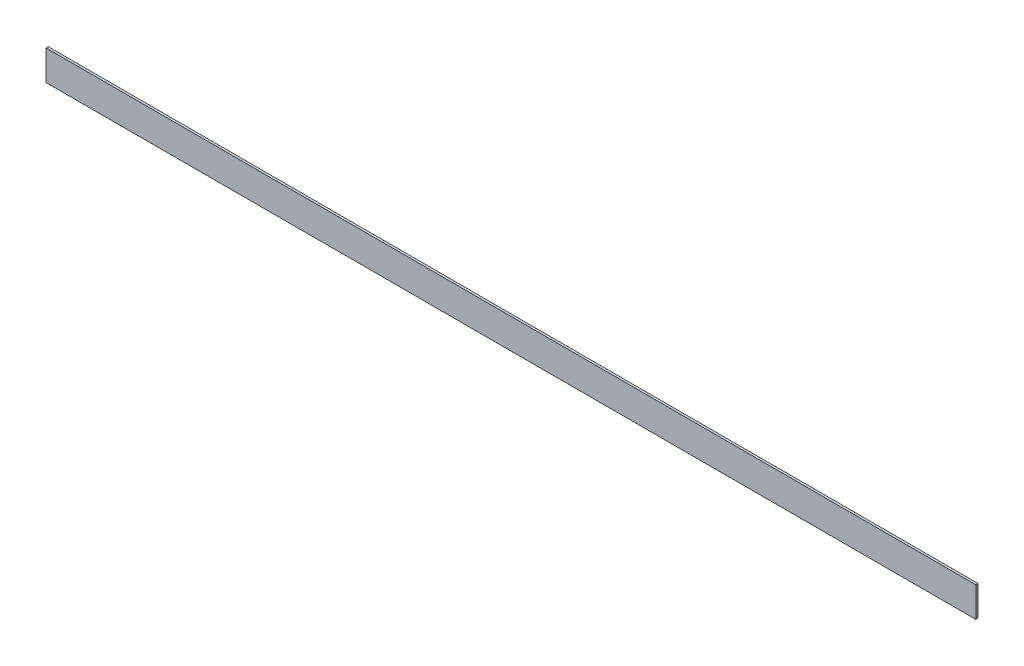
ISO-10303-21;
HEADER;
FILE_DESCRIPTION(('STEP AP214'),'2;1');
FILE_NAME('part.step','',(''),(''),'','','');
FILE_SCHEMA(('AUTOMOTIVE_DESIGN { 1 0 10303 214 1 1 1 1 }'));
ENDSEC;
DATA;
#1=APPLICATION_CONTEXT('core data for automotive mechanical design processes');
#2=APPLICATION_PROTOCOL_DEFINITION('international standard','automotive_design',2000,#1);
#3=PRODUCT_CONTEXT('',#1,'mechanical');
#4=PRODUCT('Part','Part','',(#3));
#5=PRODUCT_RELATED_PRODUCT_CATEGORY('part','',(#4));
#6=PRODUCT_DEFINITION_FORMATION('','',#4);
#7=PRODUCT_DEFINITION_CONTEXT('part definition',#1,'design');
#8=PRODUCT_DEFINITION('design','',#6,#7);
#9=PRODUCT_DEFINITION_SHAPE('','',#8);
#10=(LENGTH_UNIT() NAMED_UNIT(*) SI_UNIT(.MILLI.,.METRE.));
#11=(NAMED_UNIT(*) PLANE_ANGLE_UNIT() SI_UNIT($,.RADIAN.));
#12=(NAMED_UNIT(*) SI_UNIT($,.STERADIAN.) SOLID_ANGLE_UNIT());
#13=UNCERTAINTY_MEASURE_WITH_UNIT(LENGTH_MEASURE(1.E-05),#10,'distance_accuracy_value','');
#14=(GEOMETRIC_REPRESENTATION_CONTEXT(3) GLOBAL_UNCERTAINTY_ASSIGNED_CONTEXT((#13)) GLOBAL_UNIT_ASSIGNED_CONTEXT((#10,
#11,#12)) REPRESENTATION_CONTEXT('',''));
#15=CARTESIAN_POINT('',(0.,0.,0.));
#16=DIRECTION('',(0.,0.,1.));
#17=DIRECTION('',(1.,0.,0.));
#18=AXIS2_PLACEMENT_3D('',#15,#16,#17);
#19=CARTESIAN_POINT('',(40.,1052.,-800.));
#20=DIRECTION('',(-1.,0.,0.));
#21=DIRECTION('',(0.,0.,1.));
#22=AXIS2_PLACEMENT_3D('',#19,#20,#21);
#23=PLANE('',#22);
#24=DIRECTION('',(0.,-1.,0.));
#25=VECTOR('',#24,1.);
#26=CARTESIAN_POINT('',(40.,1052.,-798.5));
#27=LINE('',#26,#25);
#28=CARTESIAN_POINT('',(40.,1072.,-798.5));
#29=VERTEX_POINT('',#28);
#30=CARTESIAN_POINT('',(40.,1052.,-798.5));
#31=VERTEX_POINT('',#30);
#32=EDGE_CURVE('E103',#29,#31,#27,.T.);
#33=ORIENTED_EDGE('',*,*,#32,.F.);
#34=DIRECTION('',(0.,0.,1.));
#35=VECTOR('',#34,1.);
#36=CARTESIAN_POINT('',(40.,1072.,-800.));
#37=LINE('',#36,#35);
#38=CARTESIAN_POINT('',(40.,1072.,-800.));
#39=VERTEX_POINT('',#38);
#40=EDGE_CURVE('E11',#39,#29,#37,.T.);
#41=ORIENTED_EDGE('',*,*,#40,.F.);
#42=DIRECTION('',(0.,-1.,0.));
#43=VECTOR('',#42,1.);
#44=CARTESIAN_POINT('',(40.,1052.,-800.));
#45=LINE('',#44,#43);
#46=CARTESIAN_POINT('',(40.,1052.,-800.));
#47=VERTEX_POINT('',#46);
#48=EDGE_CURVE('E97',#39,#47,#45,.T.);
#49=ORIENTED_EDGE('',*,*,#48,.T.);
#50=DIRECTION('',(0.,0.,1.));
#51=VECTOR('',#50,1.);
#52=CARTESIAN_POINT('',(40.,1052.,-800.));
#53=LINE('',#52,#51);
#54=EDGE_CURVE('E42',#47,#31,#53,.T.);
#55=ORIENTED_EDGE('',*,*,#54,.T.);
#56=EDGE_LOOP('',(#33,#41,#49,#55));
#57=FACE_BOUND('',#56,.T.);
#58=ADVANCED_FACE('F39',(#57),#23,.T.);
#59=CARTESIAN_POINT('',(40.,1072.,-800.));
#60=DIRECTION('',(0.,1.,0.));
#61=DIRECTION('',(0.,0.,1.));
#62=AXIS2_PLACEMENT_3D('',#59,#60,#61);
#63=PLANE('',#62);
#64=DIRECTION('',(-1.,0.,0.));
#65=VECTOR('',#64,1.);
#66=CARTESIAN_POINT('',(40.,1072.,-798.5));
#67=LINE('',#66,#65);
#68=CARTESIAN_POINT('',(660.,1072.,-798.5));
#69=VERTEX_POINT('',#68);
#70=EDGE_CURVE('E99',#69,#29,#67,.T.);
#71=ORIENTED_EDGE('',*,*,#70,.F.);
#72=DIRECTION('',(0.,0.,1.));
#73=VECTOR('',#72,1.);
#74=CARTESIAN_POINT('',(660.,1072.,-800.));
#75=LINE('',#74,#73);
#76=CARTESIAN_POINT('',(660.,1072.,-800.));
#77=VERTEX_POINT('',#76);
#78=EDGE_CURVE('E48',#77,#69,#75,.T.);
#79=ORIENTED_EDGE('',*,*,#78,.F.);
#80=DIRECTION('',(-1.,0.,0.));
#81=VECTOR('',#80,1.);
#82=CARTESIAN_POINT('',(40.,1072.,-800.));
#83=LINE('',#82,#81);
#84=EDGE_CURVE('E94',#77,#39,#83,.T.);
#85=ORIENTED_EDGE('',*,*,#84,.T.);
#86=ORIENTED_EDGE('',*,*,#40,.T.);
#87=EDGE_LOOP('',(#71,#79,#85,#86));
#88=FACE_BOUND('',#87,.T.);
#89=ADVANCED_FACE('F113',(#88),#63,.T.);
#90=CARTESIAN_POINT('',(660.,1052.,-800.));
#91=DIRECTION('',(1.,0.,0.));
#92=DIRECTION('',(0.,0.,-1.));
#93=AXIS2_PLACEMENT_3D('',#90,#91,#92);
#94=PLANE('',#93);
#95=DIRECTION('',(0.,1.,0.));
#96=VECTOR('',#95,1.);
#97=CARTESIAN_POINT('',(660.,1052.,-798.5));
#98=LINE('',#97,#96);
#99=CARTESIAN_POINT('',(660.,1052.,-798.5));
#100=VERTEX_POINT('',#99);
#101=EDGE_CURVE('E89',#100,#69,#98,.T.);
#102=ORIENTED_EDGE('',*,*,#101,.F.);
#103=DIRECTION('',(0.,0.,1.));
#104=VECTOR('',#103,1.);
#105=CARTESIAN_POINT('',(660.,1052.,-800.));
#106=LINE('',#105,#104);
#107=CARTESIAN_POINT('',(660.,1052.,-800.));
#108=VERTEX_POINT('',#107);
#109=EDGE_CURVE('E84',#108,#100,#106,.T.);
#110=ORIENTED_EDGE('',*,*,#109,.F.);
#111=DIRECTION('',(0.,1.,0.));
#112=VECTOR('',#111,1.);
#113=CARTESIAN_POINT('',(660.,1052.,-800.));
#114=LINE('',#113,#112);
#115=EDGE_CURVE('E87',#108,#77,#114,.T.);
#116=ORIENTED_EDGE('',*,*,#115,.T.);
#117=ORIENTED_EDGE('',*,*,#78,.T.);
#118=EDGE_LOOP('',(#102,#110,#116,#117));
#119=FACE_BOUND('',#118,.T.);
#120=ADVANCED_FACE('F86',(#119),#94,.T.);
#121=CARTESIAN_POINT('',(40.,1052.,-800.));
#122=DIRECTION('',(0.,-1.,0.));
#123=DIRECTION('',(0.,0.,-1.));
#124=AXIS2_PLACEMENT_3D('',#121,#122,#123);
#125=PLANE('',#124);
#126=DIRECTION('',(1.,0.,0.));
#127=VECTOR('',#126,1.);
#128=CARTESIAN_POINT('',(40.,1052.,-798.5));
#129=LINE('',#128,#127);
#130=EDGE_CURVE('E106',#31,#100,#129,.T.);
#131=ORIENTED_EDGE('',*,*,#130,.F.);
#132=ORIENTED_EDGE('',*,*,#54,.F.);
#133=DIRECTION('',(1.,0.,0.));
#134=VECTOR('',#133,1.);
#135=CARTESIAN_POINT('',(40.,1052.,-800.));
#136=LINE('',#135,#134);
#137=EDGE_CURVE('E93',#47,#108,#136,.T.);
#138=ORIENTED_EDGE('',*,*,#137,.T.);
#139=ORIENTED_EDGE('',*,*,#109,.T.);
#140=EDGE_LOOP('',(#131,#132,#138,#139));
#141=FACE_BOUND('',#140,.T.);
#142=ADVANCED_FACE('F96',(#141),#125,.T.);
#143=CARTESIAN_POINT('',(0.,0.,-800.));
#144=DIRECTION('',(0.,0.,-1.));
#145=DIRECTION('',(-1.,0.,0.));
#146=AXIS2_PLACEMENT_3D('',#143,#144,#145);
#147=PLANE('',#146);
#148=ORIENTED_EDGE('',*,*,#48,.F.);
#149=ORIENTED_EDGE('',*,*,#84,.F.);
#150=ORIENTED_EDGE('',*,*,#115,.F.);
#151=ORIENTED_EDGE('',*,*,#137,.F.);
#152=EDGE_LOOP('',(#148,#149,#150,#151));
#153=FACE_BOUND('',#152,.T.);
#154=ADVANCED_FACE('F92',(#153),#147,.T.);
#155=CARTESIAN_POINT('',(0.,0.,-798.5));
#156=DIRECTION('',(0.,0.,-1.));
#157=DIRECTION('',(-1.,0.,0.));
#158=AXIS2_PLACEMENT_3D('',#155,#156,#157);
#159=PLANE('',#158);
#160=ORIENTED_EDGE('',*,*,#32,.T.);
#161=ORIENTED_EDGE('',*,*,#130,.T.);
#162=ORIENTED_EDGE('',*,*,#101,.T.);
#163=ORIENTED_EDGE('',*,*,#70,.T.);
#164=EDGE_LOOP('',(#160,#161,#162,#163));
#165=FACE_BOUND('',#164,.T.);
#166=ADVANCED_FACE('F112',(#165),#159,.F.);
#167=CLOSED_SHELL('',(#58,#89,#120,#142,#154,#166));
#168=MANIFOLD_SOLID_BREP('B2',#167);
#169=ADVANCED_BREP_SHAPE_REPRESENTATION('',(#18,#168),#14);
#170=SHAPE_DEFINITION_REPRESENTATION(#9,#169);
ENDSEC;
END-ISO-10303-21;
